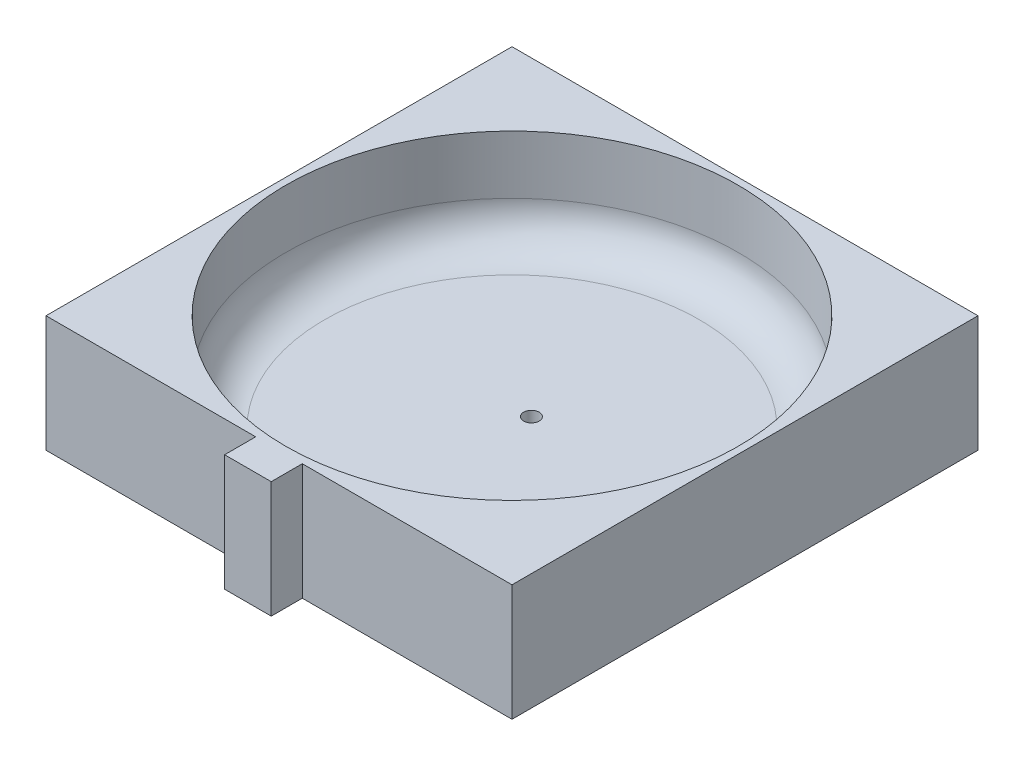
ISO-10303-21;
HEADER;
FILE_DESCRIPTION(('STEP AP214'),'2;1');
FILE_NAME('part.step','',(''),(''),'','','');
FILE_SCHEMA(('AUTOMOTIVE_DESIGN { 1 0 10303 214 1 1 1 1 }'));
ENDSEC;
DATA;
#1=APPLICATION_CONTEXT('core data for automotive mechanical design processes');
#2=APPLICATION_PROTOCOL_DEFINITION('international standard','automotive_design',2000,#1);
#3=PRODUCT_CONTEXT('',#1,'mechanical');
#4=PRODUCT('Part','Part','',(#3));
#5=PRODUCT_RELATED_PRODUCT_CATEGORY('part','',(#4));
#6=PRODUCT_DEFINITION_FORMATION('','',#4);
#7=PRODUCT_DEFINITION_CONTEXT('part definition',#1,'design');
#8=PRODUCT_DEFINITION('design','',#6,#7);
#9=PRODUCT_DEFINITION_SHAPE('','',#8);
#10=(LENGTH_UNIT() NAMED_UNIT(*) SI_UNIT(.MILLI.,.METRE.));
#11=(NAMED_UNIT(*) PLANE_ANGLE_UNIT() SI_UNIT($,.RADIAN.));
#12=(NAMED_UNIT(*) SI_UNIT($,.STERADIAN.) SOLID_ANGLE_UNIT());
#13=UNCERTAINTY_MEASURE_WITH_UNIT(LENGTH_MEASURE(1.E-05),#10,'distance_accuracy_value','');
#14=(GEOMETRIC_REPRESENTATION_CONTEXT(3) GLOBAL_UNCERTAINTY_ASSIGNED_CONTEXT((#13)) GLOBAL_UNIT_ASSIGNED_CONTEXT((#10,
#11,#12)) REPRESENTATION_CONTEXT('',''));
#15=CARTESIAN_POINT('',(0.,0.,0.));
#16=DIRECTION('',(0.,0.,1.));
#17=DIRECTION('',(1.,0.,0.));
#18=AXIS2_PLACEMENT_3D('',#15,#16,#17);
#19=CARTESIAN_POINT('',(-60.,30.,60.));
#20=DIRECTION('',(0.,0.,-1.));
#21=DIRECTION('',(-1.,0.,0.));
#22=AXIS2_PLACEMENT_3D('',#19,#20,#21);
#23=PLANE('',#22);
#24=DIRECTION('',(0.,-1.,0.));
#25=VECTOR('',#24,1.);
#26=CARTESIAN_POINT('',(-6.00000000000001,30.,60.));
#27=LINE('',#26,#25);
#28=CARTESIAN_POINT('',(-6.00000000000001,30.,60.));
#29=VERTEX_POINT('',#28);
#30=CARTESIAN_POINT('',(-6.00000000000001,0.,60.));
#31=VERTEX_POINT('',#30);
#32=EDGE_CURVE('E119',#29,#31,#27,.T.);
#33=ORIENTED_EDGE('',*,*,#32,.F.);
#34=DIRECTION('',(1.,0.,0.));
#35=VECTOR('',#34,1.);
#36=CARTESIAN_POINT('',(-60.,30.,60.));
#37=LINE('',#36,#35);
#38=CARTESIAN_POINT('',(-60.,30.,60.));
#39=VERTEX_POINT('',#38);
#40=EDGE_CURVE('E94',#39,#29,#37,.T.);
#41=ORIENTED_EDGE('',*,*,#40,.F.);
#42=DIRECTION('',(0.,-1.,0.));
#43=VECTOR('',#42,1.);
#44=CARTESIAN_POINT('',(-60.,30.,60.));
#45=LINE('',#44,#43);
#46=CARTESIAN_POINT('',(-60.,0.,60.));
#47=VERTEX_POINT('',#46);
#48=EDGE_CURVE('E173',#39,#47,#45,.T.);
#49=ORIENTED_EDGE('',*,*,#48,.T.);
#50=DIRECTION('',(1.,0.,0.));
#51=VECTOR('',#50,1.);
#52=CARTESIAN_POINT('',(-60.,0.,60.));
#53=LINE('',#52,#51);
#54=EDGE_CURVE('E129',#47,#31,#53,.T.);
#55=ORIENTED_EDGE('',*,*,#54,.T.);
#56=EDGE_LOOP('',(#33,#41,#49,#55));
#57=FACE_BOUND('',#56,.T.);
#58=ADVANCED_FACE('F39',(#57),#23,.F.);
#59=CARTESIAN_POINT('',(-60.,30.,-60.));
#60=DIRECTION('',(1.,0.,0.));
#61=DIRECTION('',(0.,0.,-1.));
#62=AXIS2_PLACEMENT_3D('',#59,#60,#61);
#63=PLANE('',#62);
#64=DIRECTION('',(0.,0.,1.));
#65=VECTOR('',#64,1.);
#66=CARTESIAN_POINT('',(-60.,0.,-60.));
#67=LINE('',#66,#65);
#68=CARTESIAN_POINT('',(-60.,0.,-60.));
#69=VERTEX_POINT('',#68);
#70=EDGE_CURVE('E151',#69,#47,#67,.T.);
#71=ORIENTED_EDGE('',*,*,#70,.T.);
#72=ORIENTED_EDGE('',*,*,#48,.F.);
#73=DIRECTION('',(0.,0.,1.));
#74=VECTOR('',#73,1.);
#75=CARTESIAN_POINT('',(-60.,30.,-60.));
#76=LINE('',#75,#74);
#77=CARTESIAN_POINT('',(-60.,30.,-60.));
#78=VERTEX_POINT('',#77);
#79=EDGE_CURVE('E136',#78,#39,#76,.T.);
#80=ORIENTED_EDGE('',*,*,#79,.F.);
#81=DIRECTION('',(0.,-1.,0.));
#82=VECTOR('',#81,1.);
#83=CARTESIAN_POINT('',(-60.,30.,-60.));
#84=LINE('',#83,#82);
#85=EDGE_CURVE('E150',#78,#69,#84,.T.);
#86=ORIENTED_EDGE('',*,*,#85,.T.);
#87=EDGE_LOOP('',(#71,#72,#80,#86));
#88=FACE_BOUND('',#87,.T.);
#89=ADVANCED_FACE('F196',(#88),#63,.F.);
#90=CARTESIAN_POINT('',(5.99999999999999,30.,60.));
#91=VERTEX_POINT('',#90);
#92=CARTESIAN_POINT('',(60.,30.,60.));
#93=VERTEX_POINT('',#92);
#94=EDGE_CURVE('E140',#91,#93,#37,.T.);
#95=ORIENTED_EDGE('',*,*,#94,.F.);
#96=DIRECTION('',(0.,-1.,0.));
#97=VECTOR('',#96,1.);
#98=CARTESIAN_POINT('',(5.99999999999999,30.,60.));
#99=LINE('',#98,#97);
#100=CARTESIAN_POINT('',(5.99999999999999,0.,60.));
#101=VERTEX_POINT('',#100);
#102=EDGE_CURVE('E131',#91,#101,#99,.T.);
#103=ORIENTED_EDGE('',*,*,#102,.T.);
#104=CARTESIAN_POINT('',(60.,0.,60.));
#105=VERTEX_POINT('',#104);
#106=EDGE_CURVE('E155',#101,#105,#53,.T.);
#107=ORIENTED_EDGE('',*,*,#106,.T.);
#108=DIRECTION('',(0.,-1.,0.));
#109=VECTOR('',#108,1.);
#110=CARTESIAN_POINT('',(60.,30.,60.));
#111=LINE('',#110,#109);
#112=EDGE_CURVE('E169',#93,#105,#111,.T.);
#113=ORIENTED_EDGE('',*,*,#112,.F.);
#114=EDGE_LOOP('',(#95,#103,#107,#113));
#115=FACE_BOUND('',#114,.T.);
#116=ADVANCED_FACE('F198',(#115),#23,.F.);
#117=CARTESIAN_POINT('',(60.,30.,-60.));
#118=DIRECTION('',(-1.,0.,0.));
#119=DIRECTION('',(0.,0.,1.));
#120=AXIS2_PLACEMENT_3D('',#117,#118,#119);
#121=PLANE('',#120);
#122=DIRECTION('',(0.,0.,-1.));
#123=VECTOR('',#122,1.);
#124=CARTESIAN_POINT('',(60.,0.,-60.));
#125=LINE('',#124,#123);
#126=CARTESIAN_POINT('',(60.,0.,-60.));
#127=VERTEX_POINT('',#126);
#128=EDGE_CURVE('E159',#105,#127,#125,.T.);
#129=ORIENTED_EDGE('',*,*,#128,.T.);
#130=DIRECTION('',(0.,-1.,0.));
#131=VECTOR('',#130,1.);
#132=CARTESIAN_POINT('',(60.,30.,-60.));
#133=LINE('',#132,#131);
#134=CARTESIAN_POINT('',(60.,30.,-60.));
#135=VERTEX_POINT('',#134);
#136=EDGE_CURVE('E166',#135,#127,#133,.T.);
#137=ORIENTED_EDGE('',*,*,#136,.F.);
#138=DIRECTION('',(0.,0.,-1.));
#139=VECTOR('',#138,1.);
#140=CARTESIAN_POINT('',(60.,30.,-60.));
#141=LINE('',#140,#139);
#142=EDGE_CURVE('E139',#93,#135,#141,.T.);
#143=ORIENTED_EDGE('',*,*,#142,.F.);
#144=ORIENTED_EDGE('',*,*,#112,.T.);
#145=EDGE_LOOP('',(#129,#137,#143,#144));
#146=FACE_BOUND('',#145,.T.);
#147=ADVANCED_FACE('F205',(#146),#121,.F.);
#148=CARTESIAN_POINT('',(-60.,30.,-60.));
#149=DIRECTION('',(0.,0.,1.));
#150=DIRECTION('',(1.,0.,0.));
#151=AXIS2_PLACEMENT_3D('',#148,#149,#150);
#152=PLANE('',#151);
#153=DIRECTION('',(-1.,0.,0.));
#154=VECTOR('',#153,1.);
#155=CARTESIAN_POINT('',(-60.,0.,-60.));
#156=LINE('',#155,#154);
#157=EDGE_CURVE('E86',#127,#69,#156,.T.);
#158=ORIENTED_EDGE('',*,*,#157,.T.);
#159=ORIENTED_EDGE('',*,*,#85,.F.);
#160=DIRECTION('',(-1.,0.,0.));
#161=VECTOR('',#160,1.);
#162=CARTESIAN_POINT('',(-60.,30.,-60.));
#163=LINE('',#162,#161);
#164=EDGE_CURVE('E65',#135,#78,#163,.T.);
#165=ORIENTED_EDGE('',*,*,#164,.F.);
#166=ORIENTED_EDGE('',*,*,#136,.T.);
#167=EDGE_LOOP('',(#158,#159,#165,#166));
#168=FACE_BOUND('',#167,.T.);
#169=ADVANCED_FACE('F210',(#168),#152,.F.);
#170=CARTESIAN_POINT('',(0.,30.,0.));
#171=DIRECTION('',(0.,1.,0.));
#172=DIRECTION('',(0.,0.,1.));
#173=AXIS2_PLACEMENT_3D('',#170,#171,#172);
#174=PLANE('',#173);
#175=CARTESIAN_POINT('',(0.,30.,0.));
#176=DIRECTION('',(0.,1.,0.));
#177=DIRECTION('',(0.,0.,1.));
#178=AXIS2_PLACEMENT_3D('',#175,#176,#177);
#179=CIRCLE('',#178,58.2519764604773);
#180=CARTESIAN_POINT('',(0.,30.,58.2519764604773));
#181=VERTEX_POINT('',#180);
#182=EDGE_CURVE('E156',#181,#181,#179,.T.);
#183=ORIENTED_EDGE('',*,*,#182,.F.);
#184=EDGE_LOOP('',(#183));
#185=FACE_BOUND('',#184,.T.);
#186=ORIENTED_EDGE('',*,*,#79,.T.);
#187=ORIENTED_EDGE('',*,*,#40,.T.);
#188=DIRECTION('',(0.,0.,-1.));
#189=VECTOR('',#188,1.);
#190=CARTESIAN_POINT('',(-6.00000000000001,30.,68.));
#191=LINE('',#190,#189);
#192=CARTESIAN_POINT('',(-6.00000000000001,30.,68.));
#193=VERTEX_POINT('',#192);
#194=EDGE_CURVE('E116',#193,#29,#191,.T.);
#195=ORIENTED_EDGE('',*,*,#194,.F.);
#196=DIRECTION('',(-1.,0.,0.));
#197=VECTOR('',#196,1.);
#198=CARTESIAN_POINT('',(-6.00000000000001,30.,68.));
#199=LINE('',#198,#197);
#200=CARTESIAN_POINT('',(5.99999999999999,30.,68.));
#201=VERTEX_POINT('',#200);
#202=EDGE_CURVE('E132',#201,#193,#199,.T.);
#203=ORIENTED_EDGE('',*,*,#202,.F.);
#204=DIRECTION('',(0.,0.,1.));
#205=VECTOR('',#204,1.);
#206=CARTESIAN_POINT('',(5.99999999999999,30.,68.));
#207=LINE('',#206,#205);
#208=EDGE_CURVE('E125',#91,#201,#207,.T.);
#209=ORIENTED_EDGE('',*,*,#208,.F.);
#210=ORIENTED_EDGE('',*,*,#94,.T.);
#211=ORIENTED_EDGE('',*,*,#142,.T.);
#212=ORIENTED_EDGE('',*,*,#164,.T.);
#213=EDGE_LOOP('',(#186,#187,#195,#203,#209,#210,#211,#212));
#214=FACE_BOUND('',#213,.T.);
#215=ADVANCED_FACE('F134',(#185,#214),#174,.T.);
#216=CARTESIAN_POINT('',(0.,0.,0.));
#217=DIRECTION('',(0.,1.,0.));
#218=DIRECTION('',(0.,0.,1.));
#219=AXIS2_PLACEMENT_3D('',#216,#217,#218);
#220=PLANE('',#219);
#221=CARTESIAN_POINT('',(0.,0.,-5.00000000000001));
#222=DIRECTION('',(0.,-1.,0.));
#223=DIRECTION('',(0.,0.,-1.));
#224=AXIS2_PLACEMENT_3D('',#221,#222,#223);
#225=CIRCLE('',#224,2.);
#226=CARTESIAN_POINT('',(0.,0.,-7.00000000000001));
#227=VERTEX_POINT('',#226);
#228=EDGE_CURVE('E234',#227,#227,#225,.T.);
#229=ORIENTED_EDGE('',*,*,#228,.F.);
#230=EDGE_LOOP('',(#229));
#231=FACE_BOUND('',#230,.T.);
#232=ORIENTED_EDGE('',*,*,#70,.F.);
#233=ORIENTED_EDGE('',*,*,#157,.F.);
#234=ORIENTED_EDGE('',*,*,#128,.F.);
#235=ORIENTED_EDGE('',*,*,#106,.F.);
#236=DIRECTION('',(0.,0.,1.));
#237=VECTOR('',#236,1.);
#238=CARTESIAN_POINT('',(5.99999999999999,0.,68.));
#239=LINE('',#238,#237);
#240=CARTESIAN_POINT('',(5.99999999999999,0.,68.));
#241=VERTEX_POINT('',#240);
#242=EDGE_CURVE('E56',#101,#241,#239,.T.);
#243=ORIENTED_EDGE('',*,*,#242,.T.);
#244=DIRECTION('',(-1.,0.,0.));
#245=VECTOR('',#244,1.);
#246=CARTESIAN_POINT('',(-6.00000000000001,0.,68.));
#247=LINE('',#246,#245);
#248=CARTESIAN_POINT('',(-6.00000000000001,0.,68.));
#249=VERTEX_POINT('',#248);
#250=EDGE_CURVE('E126',#241,#249,#247,.T.);
#251=ORIENTED_EDGE('',*,*,#250,.T.);
#252=DIRECTION('',(0.,0.,-1.));
#253=VECTOR('',#252,1.);
#254=CARTESIAN_POINT('',(-6.00000000000001,0.,68.));
#255=LINE('',#254,#253);
#256=EDGE_CURVE('E224',#249,#31,#255,.T.);
#257=ORIENTED_EDGE('',*,*,#256,.T.);
#258=ORIENTED_EDGE('',*,*,#54,.F.);
#259=EDGE_LOOP('',(#232,#233,#234,#235,#243,#251,#257,#258));
#260=FACE_BOUND('',#259,.T.);
#261=ADVANCED_FACE('F252',(#231,#260),#220,.F.);
#262=CARTESIAN_POINT('',(0.,5.,0.));
#263=DIRECTION('',(0.,1.,0.));
#264=DIRECTION('',(0.,0.,1.));
#265=AXIS2_PLACEMENT_3D('',#262,#263,#264);
#266=CYLINDRICAL_SURFACE('',#265,58.2519764604773);
#267=CARTESIAN_POINT('',(0.,15.,0.));
#268=DIRECTION('',(0.,1.,0.));
#269=DIRECTION('',(0.,0.,1.));
#270=AXIS2_PLACEMENT_3D('',#267,#268,#269);
#271=CIRCLE('',#270,58.2519764604773);
#272=CARTESIAN_POINT('',(0.,15.,58.2519764604773));
#273=VERTEX_POINT('',#272);
#274=EDGE_CURVE('E11',#273,#273,#271,.F.);
#275=ORIENTED_EDGE('',*,*,#274,.T.);
#276=EDGE_LOOP('',(#275));
#277=FACE_BOUND('',#276,.T.);
#278=ORIENTED_EDGE('',*,*,#182,.T.);
#279=EDGE_LOOP('',(#278));
#280=FACE_BOUND('',#279,.T.);
#281=ADVANCED_FACE('F191',(#277,#280),#266,.F.);
#282=CARTESIAN_POINT('',(0.,5.,0.));
#283=DIRECTION('',(0.,1.,0.));
#284=DIRECTION('',(0.,0.,1.));
#285=AXIS2_PLACEMENT_3D('',#282,#283,#284);
#286=PLANE('',#285);
#287=CARTESIAN_POINT('',(0.,5.,-5.00000000000001));
#288=DIRECTION('',(0.,1.,0.));
#289=DIRECTION('',(0.,0.,1.));
#290=AXIS2_PLACEMENT_3D('',#287,#288,#289);
#291=CIRCLE('',#290,2.);
#292=CARTESIAN_POINT('',(0.,5.,-3.00000000000001));
#293=VERTEX_POINT('',#292);
#294=EDGE_CURVE('E43',#293,#293,#291,.T.);
#295=ORIENTED_EDGE('',*,*,#294,.F.);
#296=EDGE_LOOP('',(#295));
#297=FACE_BOUND('',#296,.T.);
#298=CARTESIAN_POINT('',(0.,5.,0.));
#299=DIRECTION('',(0.,1.,0.));
#300=DIRECTION('',(0.,0.,1.));
#301=AXIS2_PLACEMENT_3D('',#298,#299,#300);
#302=CIRCLE('',#301,48.2519764604773);
#303=CARTESIAN_POINT('',(0.,5.,48.2519764604773));
#304=VERTEX_POINT('',#303);
#305=EDGE_CURVE('E49',#304,#304,#302,.T.);
#306=ORIENTED_EDGE('',*,*,#305,.T.);
#307=EDGE_LOOP('',(#306));
#308=FACE_BOUND('',#307,.T.);
#309=ADVANCED_FACE('F180',(#297,#308),#286,.T.);
#310=CARTESIAN_POINT('',(0.,15.,0.));
#311=DIRECTION('',(0.,1.,0.));
#312=DIRECTION('',(0.,0.,1.));
#313=AXIS2_PLACEMENT_3D('',#310,#311,#312);
#314=TOROIDAL_SURFACE('',#313,48.2519764604773,10.);
#315=ORIENTED_EDGE('',*,*,#274,.F.);
#316=EDGE_LOOP('',(#315));
#317=FACE_BOUND('',#316,.T.);
#318=ORIENTED_EDGE('',*,*,#305,.F.);
#319=EDGE_LOOP('',(#318));
#320=FACE_BOUND('',#319,.T.);
#321=ADVANCED_FACE('F41',(#317,#320),#314,.F.);
#322=CARTESIAN_POINT('',(0.,25.,-5.00000000000001));
#323=DIRECTION('',(0.,-1.,0.));
#324=DIRECTION('',(0.,0.,-1.));
#325=AXIS2_PLACEMENT_3D('',#322,#323,#324);
#326=CYLINDRICAL_SURFACE('',#325,2.);
#327=ORIENTED_EDGE('',*,*,#294,.T.);
#328=EDGE_LOOP('',(#327));
#329=FACE_BOUND('',#328,.T.);
#330=ORIENTED_EDGE('',*,*,#228,.T.);
#331=EDGE_LOOP('',(#330));
#332=FACE_BOUND('',#331,.T.);
#333=ADVANCED_FACE('F183',(#329,#332),#326,.F.);
#334=CARTESIAN_POINT('',(-6.00000000000001,30.,68.));
#335=DIRECTION('',(-1.,0.,0.));
#336=DIRECTION('',(0.,0.,1.));
#337=AXIS2_PLACEMENT_3D('',#334,#335,#336);
#338=PLANE('',#337);
#339=ORIENTED_EDGE('',*,*,#256,.F.);
#340=DIRECTION('',(0.,-1.,0.));
#341=VECTOR('',#340,1.);
#342=CARTESIAN_POINT('',(-6.00000000000001,30.,68.));
#343=LINE('',#342,#341);
#344=EDGE_CURVE('E121',#193,#249,#343,.T.);
#345=ORIENTED_EDGE('',*,*,#344,.F.);
#346=ORIENTED_EDGE('',*,*,#194,.T.);
#347=ORIENTED_EDGE('',*,*,#32,.T.);
#348=EDGE_LOOP('',(#339,#345,#346,#347));
#349=FACE_BOUND('',#348,.T.);
#350=ADVANCED_FACE('F118',(#349),#338,.T.);
#351=CARTESIAN_POINT('',(-6.00000000000001,30.,68.));
#352=DIRECTION('',(0.,0.,1.));
#353=DIRECTION('',(1.,0.,0.));
#354=AXIS2_PLACEMENT_3D('',#351,#352,#353);
#355=PLANE('',#354);
#356=ORIENTED_EDGE('',*,*,#250,.F.);
#357=DIRECTION('',(0.,-1.,0.));
#358=VECTOR('',#357,1.);
#359=CARTESIAN_POINT('',(5.99999999999999,30.,68.));
#360=LINE('',#359,#358);
#361=EDGE_CURVE('E235',#201,#241,#360,.T.);
#362=ORIENTED_EDGE('',*,*,#361,.F.);
#363=ORIENTED_EDGE('',*,*,#202,.T.);
#364=ORIENTED_EDGE('',*,*,#344,.T.);
#365=EDGE_LOOP('',(#356,#362,#363,#364));
#366=FACE_BOUND('',#365,.T.);
#367=ADVANCED_FACE('F262',(#366),#355,.T.);
#368=CARTESIAN_POINT('',(5.99999999999999,30.,68.));
#369=DIRECTION('',(1.,0.,0.));
#370=DIRECTION('',(0.,0.,-1.));
#371=AXIS2_PLACEMENT_3D('',#368,#369,#370);
#372=PLANE('',#371);
#373=ORIENTED_EDGE('',*,*,#242,.F.);
#374=ORIENTED_EDGE('',*,*,#102,.F.);
#375=ORIENTED_EDGE('',*,*,#208,.T.);
#376=ORIENTED_EDGE('',*,*,#361,.T.);
#377=EDGE_LOOP('',(#373,#374,#375,#376));
#378=FACE_BOUND('',#377,.T.);
#379=ADVANCED_FACE('F263',(#378),#372,.T.);
#380=CLOSED_SHELL('',(#58,#89,#116,#147,#169,#215,#261,#281,#309,#321,#333,#350,#367,#379));
#381=MANIFOLD_SOLID_BREP('B2',#380);
#382=ADVANCED_BREP_SHAPE_REPRESENTATION('',(#18,#381),#14);
#383=SHAPE_DEFINITION_REPRESENTATION(#9,#382);
ENDSEC;
END-ISO-10303-21;
